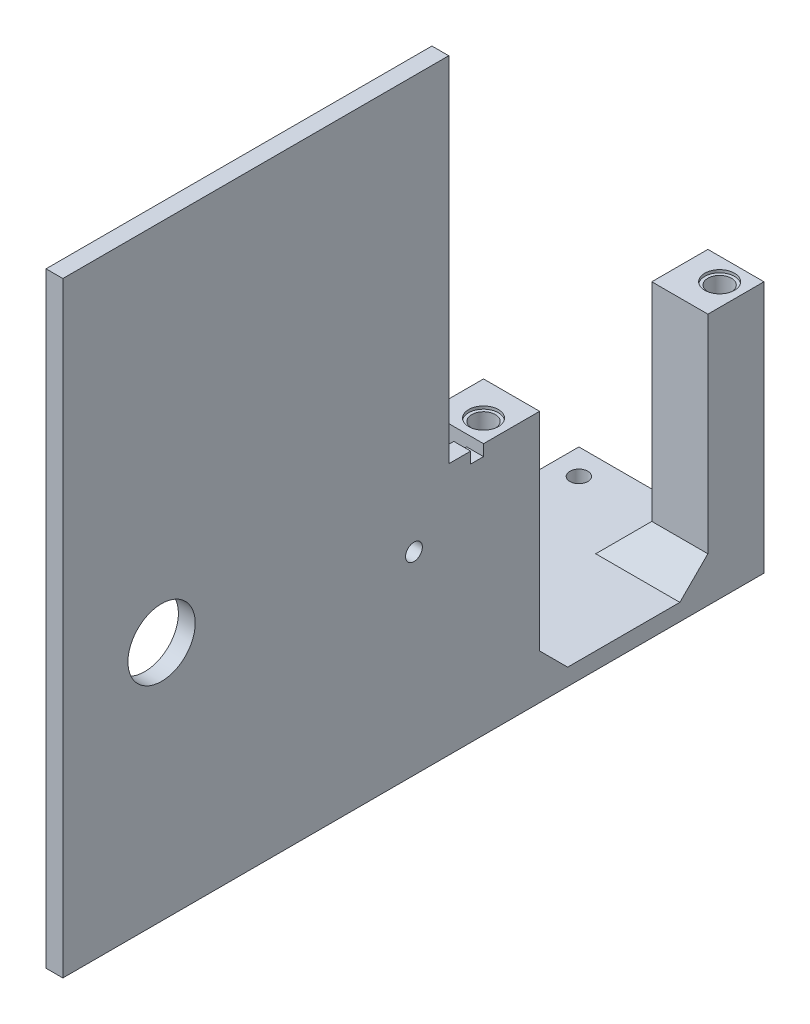
ISO-10303-21;
HEADER;
FILE_DESCRIPTION(('STEP AP214'),'2;1');
FILE_NAME('part.step','',(''),(''),'','','');
FILE_SCHEMA(('AUTOMOTIVE_DESIGN { 1 0 10303 214 1 1 1 1 }'));
ENDSEC;
DATA;
#1=APPLICATION_CONTEXT('core data for automotive mechanical design processes');
#2=APPLICATION_PROTOCOL_DEFINITION('international standard','automotive_design',2000,#1);
#3=PRODUCT_CONTEXT('',#1,'mechanical');
#4=PRODUCT('Part','Part','',(#3));
#5=PRODUCT_RELATED_PRODUCT_CATEGORY('part','',(#4));
#6=PRODUCT_DEFINITION_FORMATION('','',#4);
#7=PRODUCT_DEFINITION_CONTEXT('part definition',#1,'design');
#8=PRODUCT_DEFINITION('design','',#6,#7);
#9=PRODUCT_DEFINITION_SHAPE('','',#8);
#10=(LENGTH_UNIT() NAMED_UNIT(*) SI_UNIT(.MILLI.,.METRE.));
#11=(NAMED_UNIT(*) PLANE_ANGLE_UNIT() SI_UNIT($,.RADIAN.));
#12=(NAMED_UNIT(*) SI_UNIT($,.STERADIAN.) SOLID_ANGLE_UNIT());
#13=UNCERTAINTY_MEASURE_WITH_UNIT(LENGTH_MEASURE(1.E-05),#10,'distance_accuracy_value','');
#14=(GEOMETRIC_REPRESENTATION_CONTEXT(3) GLOBAL_UNCERTAINTY_ASSIGNED_CONTEXT((#13)) GLOBAL_UNIT_ASSIGNED_CONTEXT((#10,
#11,#12)) REPRESENTATION_CONTEXT('',''));
#15=CARTESIAN_POINT('',(0.,0.,0.));
#16=DIRECTION('',(0.,0.,1.));
#17=DIRECTION('',(1.,0.,0.));
#18=AXIS2_PLACEMENT_3D('',#15,#16,#17);
#19=CARTESIAN_POINT('',(26.4876033057851,43.,115.314049586777));
#20=DIRECTION('',(0.,-1.,0.));
#21=DIRECTION('',(0.,0.,-1.));
#22=AXIS2_PLACEMENT_3D('',#19,#20,#21);
#23=PLANE('',#22);
#24=DIRECTION('',(-1.,0.,0.));
#25=VECTOR('',#24,1.);
#26=CARTESIAN_POINT('',(23.4876033057851,43.,42.6140495867769));
#27=LINE('',#26,#25);
#28=CARTESIAN_POINT('',(26.4876033057851,43.,42.6140495867769));
#29=VERTEX_POINT('',#28);
#30=CARTESIAN_POINT('',(23.4876033057851,43.,42.6140495867769));
#31=VERTEX_POINT('',#30);
#32=EDGE_CURVE('E102',#29,#31,#27,.T.);
#33=ORIENTED_EDGE('',*,*,#32,.F.);
#34=DIRECTION('',(0.,0.,-1.));
#35=VECTOR('',#34,1.);
#36=CARTESIAN_POINT('',(26.4876033057851,43.,115.314049586777));
#37=LINE('',#36,#35);
#38=CARTESIAN_POINT('',(26.4876033057851,43.,40.3140495867769));
#39=VERTEX_POINT('',#38);
#40=EDGE_CURVE('E109',#29,#39,#37,.T.);
#41=ORIENTED_EDGE('',*,*,#40,.T.);
#42=DIRECTION('',(-1.,0.,0.));
#43=VECTOR('',#42,1.);
#44=CARTESIAN_POINT('',(26.4876033057851,43.,40.3140495867769));
#45=LINE('',#44,#43);
#46=CARTESIAN_POINT('',(23.4876033057851,43.,40.3140495867769));
#47=VERTEX_POINT('',#46);
#48=EDGE_CURVE('E284',#39,#47,#45,.T.);
#49=ORIENTED_EDGE('',*,*,#48,.T.);
#50=DIRECTION('',(0.,0.,-1.));
#51=VECTOR('',#50,1.);
#52=CARTESIAN_POINT('',(23.4876033057851,43.,115.314049586777));
#53=LINE('',#52,#51);
#54=EDGE_CURVE('E319',#31,#47,#53,.T.);
#55=ORIENTED_EDGE('',*,*,#54,.F.);
#56=EDGE_LOOP('',(#33,#41,#49,#55));
#57=FACE_BOUND('',#56,.T.);
#58=ADVANCED_FACE('F83',(#57),#23,.F.);
#59=CARTESIAN_POINT('',(-6.51239669421487,3.,40.3140495867769));
#60=DIRECTION('',(0.,0.,-1.));
#61=DIRECTION('',(-1.,0.,0.));
#62=AXIS2_PLACEMENT_3D('',#59,#60,#61);
#63=PLANE('',#62);
#64=DIRECTION('',(0.,-1.,0.));
#65=VECTOR('',#64,1.);
#66=CARTESIAN_POINT('',(23.4876033057851,43.,40.3140495867769));
#67=LINE('',#66,#65);
#68=CARTESIAN_POINT('',(23.4876033057851,0.,40.3140495867769));
#69=VERTEX_POINT('',#68);
#70=EDGE_CURVE('E303',#47,#69,#67,.T.);
#71=ORIENTED_EDGE('',*,*,#70,.F.);
#72=ORIENTED_EDGE('',*,*,#48,.F.);
#73=DIRECTION('',(0.,-1.,0.));
#74=VECTOR('',#73,1.);
#75=CARTESIAN_POINT('',(26.4876033057851,3.,40.3140495867769));
#76=LINE('',#75,#74);
#77=CARTESIAN_POINT('',(26.4876033057851,45.,40.3140495867769));
#78=VERTEX_POINT('',#77);
#79=EDGE_CURVE('E465',#78,#39,#76,.T.);
#80=ORIENTED_EDGE('',*,*,#79,.F.);
#81=DIRECTION('',(1.,0.,0.));
#82=VECTOR('',#81,1.);
#83=CARTESIAN_POINT('',(26.4876033057851,45.,40.3140495867769));
#84=LINE('',#83,#82);
#85=CARTESIAN_POINT('',(16.4876033057851,45.,40.3140495867769));
#86=VERTEX_POINT('',#85);
#87=EDGE_CURVE('E394',#86,#78,#84,.T.);
#88=ORIENTED_EDGE('',*,*,#87,.F.);
#89=DIRECTION('',(0.,-1.,0.));
#90=VECTOR('',#89,1.);
#91=CARTESIAN_POINT('',(16.4876033057851,45.,40.3140495867769));
#92=LINE('',#91,#90);
#93=CARTESIAN_POINT('',(16.4876033057851,8.00000000000004,40.3140495867769));
#94=VERTEX_POINT('',#93);
#95=EDGE_CURVE('E398',#86,#94,#92,.T.);
#96=ORIENTED_EDGE('',*,*,#95,.T.);
#97=DIRECTION('',(0.707106781186544,0.707106781186551,0.));
#98=VECTOR('',#97,1.);
#99=CARTESIAN_POINT('',(2.48760330578524,-6.00000000000001,40.3140495867769));
#100=LINE('',#99,#98);
#101=CARTESIAN_POINT('',(11.4876033057852,3.,40.3140495867769));
#102=VERTEX_POINT('',#101);
#103=EDGE_CURVE('E94',#94,#102,#100,.F.);
#104=ORIENTED_EDGE('',*,*,#103,.T.);
#105=DIRECTION('',(1.,0.,0.));
#106=VECTOR('',#105,1.);
#107=CARTESIAN_POINT('',(1.48760330578513,3.,40.3140495867769));
#108=LINE('',#107,#106);
#109=CARTESIAN_POINT('',(-6.51239669421487,3.,40.3140495867769));
#110=VERTEX_POINT('',#109);
#111=EDGE_CURVE('E436',#110,#102,#108,.T.);
#112=ORIENTED_EDGE('',*,*,#111,.F.);
#113=DIRECTION('',(0.,-1.,0.));
#114=VECTOR('',#113,1.);
#115=CARTESIAN_POINT('',(-6.51239669421487,3.,40.3140495867769));
#116=LINE('',#115,#114);
#117=CARTESIAN_POINT('',(-6.51239669421487,0.,40.3140495867769));
#118=VERTEX_POINT('',#117);
#119=EDGE_CURVE('E461',#110,#118,#116,.T.);
#120=ORIENTED_EDGE('',*,*,#119,.T.);
#121=DIRECTION('',(1.,0.,0.));
#122=VECTOR('',#121,1.);
#123=CARTESIAN_POINT('',(-6.51239669421487,0.,40.3140495867769));
#124=LINE('',#123,#122);
#125=EDGE_CURVE('E451',#118,#69,#124,.T.);
#126=ORIENTED_EDGE('',*,*,#125,.T.);
#127=EDGE_LOOP('',(#71,#72,#80,#88,#96,#104,#112,#120,#126));
#128=FACE_BOUND('',#127,.T.);
#129=ADVANCED_FACE('F529',(#128),#63,.F.);
#130=CARTESIAN_POINT('',(22.5376033057851,-7.,-5.73595041322314));
#131=DIRECTION('',(0.,1.,0.));
#132=DIRECTION('',(0.,0.,1.));
#133=AXIS2_PLACEMENT_3D('',#130,#131,#132);
#134=CYLINDRICAL_SURFACE('',#133,2.1);
#135=CARTESIAN_POINT('',(22.5376033057851,44.5,-5.73595041322314));
#136=DIRECTION('',(0.,1.,0.));
#137=DIRECTION('',(0.,0.,1.));
#138=AXIS2_PLACEMENT_3D('',#135,#136,#137);
#139=CIRCLE('',#138,2.1);
#140=CARTESIAN_POINT('',(22.5376033057851,44.5,-3.63595041322314));
#141=VERTEX_POINT('',#140);
#142=EDGE_CURVE('E510',#141,#141,#139,.F.);
#143=ORIENTED_EDGE('',*,*,#142,.F.);
#144=EDGE_LOOP('',(#143));
#145=FACE_BOUND('',#144,.T.);
#146=CARTESIAN_POINT('',(22.5376033057851,0.5,-5.73595041322314));
#147=DIRECTION('',(0.,-1.,0.));
#148=DIRECTION('',(0.,0.,-1.));
#149=AXIS2_PLACEMENT_3D('',#146,#147,#148);
#150=CIRCLE('',#149,2.1);
#151=CARTESIAN_POINT('',(22.5376033057851,0.5,-7.83595041322314));
#152=VERTEX_POINT('',#151);
#153=EDGE_CURVE('E88',#152,#152,#150,.F.);
#154=ORIENTED_EDGE('',*,*,#153,.F.);
#155=EDGE_LOOP('',(#154));
#156=FACE_BOUND('',#155,.T.);
#157=ADVANCED_FACE('F526',(#145,#156),#134,.F.);
#158=CARTESIAN_POINT('',(22.5376033057851,-7.,36.3640495867769));
#159=DIRECTION('',(0.,1.,0.));
#160=DIRECTION('',(0.,0.,1.));
#161=AXIS2_PLACEMENT_3D('',#158,#159,#160);
#162=CYLINDRICAL_SURFACE('',#161,2.1);
#163=CARTESIAN_POINT('',(22.5376033057851,44.5,36.3640495867769));
#164=DIRECTION('',(0.,1.,0.));
#165=DIRECTION('',(0.,0.,1.));
#166=AXIS2_PLACEMENT_3D('',#163,#164,#165);
#167=CIRCLE('',#166,2.1);
#168=CARTESIAN_POINT('',(22.5376033057851,44.5,38.4640495867769));
#169=VERTEX_POINT('',#168);
#170=EDGE_CURVE('E345',#169,#169,#167,.F.);
#171=ORIENTED_EDGE('',*,*,#170,.F.);
#172=EDGE_LOOP('',(#171));
#173=FACE_BOUND('',#172,.T.);
#174=CARTESIAN_POINT('',(22.5376033057851,0.5,36.3640495867769));
#175=DIRECTION('',(0.,-1.,0.));
#176=DIRECTION('',(0.,0.,-1.));
#177=AXIS2_PLACEMENT_3D('',#174,#175,#176);
#178=CIRCLE('',#177,2.1);
#179=CARTESIAN_POINT('',(22.5376033057851,0.5,34.2640495867769));
#180=VERTEX_POINT('',#179);
#181=EDGE_CURVE('E329',#180,#180,#178,.F.);
#182=ORIENTED_EDGE('',*,*,#181,.F.);
#183=EDGE_LOOP('',(#182));
#184=FACE_BOUND('',#183,.T.);
#185=ADVANCED_FACE('F528',(#173,#184),#162,.F.);
#186=CARTESIAN_POINT('',(0.,3.,0.));
#187=DIRECTION('',(0.,-1.,0.));
#188=DIRECTION('',(0.,0.,-1.));
#189=AXIS2_PLACEMENT_3D('',#186,#187,#188);
#190=PLANE('',#189);
#191=CARTESIAN_POINT('',(-1.96239669421488,3.,-5.13595041322314));
#192=DIRECTION('',(0.,1.,0.));
#193=DIRECTION('',(0.,0.,1.));
#194=AXIS2_PLACEMENT_3D('',#191,#192,#193);
#195=CIRCLE('',#194,1.6);
#196=CARTESIAN_POINT('',(-1.96239669421488,3.,-3.53595041322314));
#197=VERTEX_POINT('',#196);
#198=EDGE_CURVE('E419',#197,#197,#195,.T.);
#199=ORIENTED_EDGE('',*,*,#198,.F.);
#200=EDGE_LOOP('',(#199));
#201=FACE_BOUND('',#200,.T.);
#202=CARTESIAN_POINT('',(-1.96239669421487,3.,35.7640495867769));
#203=DIRECTION('',(0.,1.,0.));
#204=DIRECTION('',(0.,0.,1.));
#205=AXIS2_PLACEMENT_3D('',#202,#203,#204);
#206=CIRCLE('',#205,1.6);
#207=CARTESIAN_POINT('',(-1.96239669421487,3.,37.3640495867769));
#208=VERTEX_POINT('',#207);
#209=EDGE_CURVE('E411',#208,#208,#206,.T.);
#210=ORIENTED_EDGE('',*,*,#209,.F.);
#211=EDGE_LOOP('',(#210));
#212=FACE_BOUND('',#211,.T.);
#213=DIRECTION('',(-1.,0.,0.));
#214=VECTOR('',#213,1.);
#215=CARTESIAN_POINT('',(16.4876033057851,3.,5.31404958677684));
#216=LINE('',#215,#214);
#217=CARTESIAN_POINT('',(26.4876033057851,3.,5.31404958677684));
#218=VERTEX_POINT('',#217);
#219=CARTESIAN_POINT('',(11.4876033057851,3.,5.31404958677685));
#220=VERTEX_POINT('',#219);
#221=EDGE_CURVE('E480',#218,#220,#216,.T.);
#222=ORIENTED_EDGE('',*,*,#221,.T.);
#223=DIRECTION('',(0.,0.,-1.));
#224=VECTOR('',#223,1.);
#225=CARTESIAN_POINT('',(11.4876033057851,3.,-9.68595041322314));
#226=LINE('',#225,#224);
#227=CARTESIAN_POINT('',(11.4876033057851,3.,-9.68595041322314));
#228=VERTEX_POINT('',#227);
#229=EDGE_CURVE('E483',#220,#228,#226,.T.);
#230=ORIENTED_EDGE('',*,*,#229,.T.);
#231=DIRECTION('',(1.,0.,0.));
#232=VECTOR('',#231,1.);
#233=CARTESIAN_POINT('',(-6.51239669421488,3.,-9.68595041322314));
#234=LINE('',#233,#232);
#235=CARTESIAN_POINT('',(-6.51239669421488,3.,-9.68595041322314));
#236=VERTEX_POINT('',#235);
#237=EDGE_CURVE('E427',#236,#228,#234,.T.);
#238=ORIENTED_EDGE('',*,*,#237,.F.);
#239=DIRECTION('',(0.,0.,1.));
#240=VECTOR('',#239,1.);
#241=CARTESIAN_POINT('',(-6.51239669421488,3.,-9.68595041322314));
#242=LINE('',#241,#240);
#243=EDGE_CURVE('E440',#236,#110,#242,.T.);
#244=ORIENTED_EDGE('',*,*,#243,.T.);
#245=ORIENTED_EDGE('',*,*,#111,.T.);
#246=DIRECTION('',(0.,0.,-1.));
#247=VECTOR('',#246,1.);
#248=CARTESIAN_POINT('',(11.4876033057852,3.,30.3140495867769));
#249=LINE('',#248,#247);
#250=CARTESIAN_POINT('',(11.4876033057852,3.,25.3140495867769));
#251=VERTEX_POINT('',#250);
#252=EDGE_CURVE('E477',#102,#251,#249,.T.);
#253=ORIENTED_EDGE('',*,*,#252,.T.);
#254=DIRECTION('',(1.,0.,0.));
#255=VECTOR('',#254,1.);
#256=CARTESIAN_POINT('',(26.4876033057851,3.,25.3140495867769));
#257=LINE('',#256,#255);
#258=CARTESIAN_POINT('',(26.4876033057851,3.,25.3140495867769));
#259=VERTEX_POINT('',#258);
#260=EDGE_CURVE('E474',#251,#259,#257,.T.);
#261=ORIENTED_EDGE('',*,*,#260,.T.);
#262=DIRECTION('',(0.,0.,1.));
#263=VECTOR('',#262,1.);
#264=CARTESIAN_POINT('',(26.4876033057851,3.,-9.68595041322314));
#265=LINE('',#264,#263);
#266=EDGE_CURVE('E431',#218,#259,#265,.T.);
#267=ORIENTED_EDGE('',*,*,#266,.F.);
#268=EDGE_LOOP('',(#222,#230,#238,#244,#245,#253,#261,#267));
#269=FACE_BOUND('',#268,.T.);
#270=ADVANCED_FACE('F535',(#201,#212,#269),#190,.F.);
#271=CARTESIAN_POINT('',(0.,0.,0.));
#272=DIRECTION('',(0.,-1.,0.));
#273=DIRECTION('',(0.,0.,-1.));
#274=AXIS2_PLACEMENT_3D('',#271,#272,#273);
#275=PLANE('',#274);
#276=CARTESIAN_POINT('',(22.5376033057851,0.,36.3640495867769));
#277=DIRECTION('',(0.,1.,0.));
#278=DIRECTION('',(0.,0.,1.));
#279=AXIS2_PLACEMENT_3D('',#276,#277,#278);
#280=CIRCLE('',#279,2.65);
#281=CARTESIAN_POINT('',(22.5376033057851,0.,39.0140495867769));
#282=VERTEX_POINT('',#281);
#283=EDGE_CURVE('E330',#282,#282,#280,.T.);
#284=ORIENTED_EDGE('',*,*,#283,.T.);
#285=EDGE_LOOP('',(#284));
#286=FACE_BOUND('',#285,.T.);
#287=CARTESIAN_POINT('',(22.5376033057851,0.,-5.73595041322314));
#288=DIRECTION('',(0.,1.,0.));
#289=DIRECTION('',(0.,0.,1.));
#290=AXIS2_PLACEMENT_3D('',#287,#288,#289);
#291=CIRCLE('',#290,2.65);
#292=CARTESIAN_POINT('',(22.5376033057851,0.,-3.08595041322314));
#293=VERTEX_POINT('',#292);
#294=EDGE_CURVE('E324',#293,#293,#291,.T.);
#295=ORIENTED_EDGE('',*,*,#294,.T.);
#296=EDGE_LOOP('',(#295));
#297=FACE_BOUND('',#296,.T.);
#298=CARTESIAN_POINT('',(-1.96239669421488,0.,-5.13595041322314));
#299=DIRECTION('',(0.,1.,0.));
#300=DIRECTION('',(0.,0.,1.));
#301=AXIS2_PLACEMENT_3D('',#298,#299,#300);
#302=CIRCLE('',#301,1.6);
#303=CARTESIAN_POINT('',(-1.96239669421488,0.,-3.53595041322314));
#304=VERTEX_POINT('',#303);
#305=EDGE_CURVE('E415',#304,#304,#302,.T.);
#306=ORIENTED_EDGE('',*,*,#305,.T.);
#307=EDGE_LOOP('',(#306));
#308=FACE_BOUND('',#307,.T.);
#309=DIRECTION('',(0.,0.,1.));
#310=VECTOR('',#309,1.);
#311=CARTESIAN_POINT('',(-6.51239669421488,0.,-9.68595041322314));
#312=LINE('',#311,#310);
#313=CARTESIAN_POINT('',(-6.51239669421488,0.,-9.68595041322314));
#314=VERTEX_POINT('',#313);
#315=EDGE_CURVE('E432',#314,#118,#312,.T.);
#316=ORIENTED_EDGE('',*,*,#315,.F.);
#317=DIRECTION('',(1.,0.,0.));
#318=VECTOR('',#317,1.);
#319=CARTESIAN_POINT('',(1.48760330578512,0.,-9.68595041322314));
#320=LINE('',#319,#318);
#321=CARTESIAN_POINT('',(26.4876033057851,0.,-9.68595041322314));
#322=VERTEX_POINT('',#321);
#323=EDGE_CURVE('E423',#314,#322,#320,.T.);
#324=ORIENTED_EDGE('',*,*,#323,.T.);
#325=DIRECTION('',(0.,0.,1.));
#326=VECTOR('',#325,1.);
#327=CARTESIAN_POINT('',(26.4876033057851,0.,-9.68595041322314));
#328=LINE('',#327,#326);
#329=CARTESIAN_POINT('',(26.4876033057851,0.,115.314049586777));
#330=VERTEX_POINT('',#329);
#331=EDGE_CURVE('E448',#322,#330,#328,.T.);
#332=ORIENTED_EDGE('',*,*,#331,.T.);
#333=DIRECTION('',(1.,0.,0.));
#334=VECTOR('',#333,1.);
#335=CARTESIAN_POINT('',(26.4876033057851,0.,115.314049586777));
#336=LINE('',#335,#334);
#337=CARTESIAN_POINT('',(23.4876033057851,0.,115.314049586777));
#338=VERTEX_POINT('',#337);
#339=EDGE_CURVE('E306',#338,#330,#336,.T.);
#340=ORIENTED_EDGE('',*,*,#339,.F.);
#341=DIRECTION('',(0.,0.,-1.));
#342=VECTOR('',#341,1.);
#343=CARTESIAN_POINT('',(23.4876033057851,0.,115.314049586777));
#344=LINE('',#343,#342);
#345=EDGE_CURVE('E310',#338,#69,#344,.T.);
#346=ORIENTED_EDGE('',*,*,#345,.T.);
#347=ORIENTED_EDGE('',*,*,#125,.F.);
#348=EDGE_LOOP('',(#316,#324,#332,#340,#346,#347));
#349=FACE_BOUND('',#348,.T.);
#350=CARTESIAN_POINT('',(-1.96239669421487,0.,35.7640495867769));
#351=DIRECTION('',(0.,1.,0.));
#352=DIRECTION('',(0.,0.,1.));
#353=AXIS2_PLACEMENT_3D('',#350,#351,#352);
#354=CIRCLE('',#353,1.6);
#355=CARTESIAN_POINT('',(-1.96239669421487,0.,37.3640495867769));
#356=VERTEX_POINT('',#355);
#357=EDGE_CURVE('E410',#356,#356,#354,.T.);
#358=ORIENTED_EDGE('',*,*,#357,.T.);
#359=EDGE_LOOP('',(#358));
#360=FACE_BOUND('',#359,.T.);
#361=ADVANCED_FACE('F656',(#286,#297,#308,#349,#360),#275,.T.);
#362=CARTESIAN_POINT('',(-6.51239669421488,3.,-9.68595041322314));
#363=DIRECTION('',(1.,0.,0.));
#364=DIRECTION('',(0.,0.,-1.));
#365=AXIS2_PLACEMENT_3D('',#362,#363,#364);
#366=PLANE('',#365);
#367=ORIENTED_EDGE('',*,*,#315,.T.);
#368=ORIENTED_EDGE('',*,*,#119,.F.);
#369=ORIENTED_EDGE('',*,*,#243,.F.);
#370=DIRECTION('',(0.,-1.,0.));
#371=VECTOR('',#370,1.);
#372=CARTESIAN_POINT('',(-6.51239669421488,3.,-9.68595041322314));
#373=LINE('',#372,#371);
#374=EDGE_CURVE('E456',#236,#314,#373,.T.);
#375=ORIENTED_EDGE('',*,*,#374,.T.);
#376=EDGE_LOOP('',(#367,#368,#369,#375));
#377=FACE_BOUND('',#376,.T.);
#378=ADVANCED_FACE('F659',(#377),#366,.F.);
#379=CARTESIAN_POINT('',(26.4876033057851,3.,-9.68595041322314));
#380=DIRECTION('',(1.,0.,0.));
#381=DIRECTION('',(0.,0.,-1.));
#382=AXIS2_PLACEMENT_3D('',#379,#380,#381);
#383=PLANE('',#382);
#384=CARTESIAN_POINT('',(26.4876033057851,43.,97.7140495867768));
#385=DIRECTION('',(1.,0.,0.));
#386=DIRECTION('',(0.,0.,-1.));
#387=AXIS2_PLACEMENT_3D('',#384,#385,#386);
#388=CIRCLE('',#387,6.);
#389=CARTESIAN_POINT('',(26.4876033057851,43.,91.7140495867768));
#390=VERTEX_POINT('',#389);
#391=EDGE_CURVE('E264',#390,#390,#388,.T.);
#392=ORIENTED_EDGE('',*,*,#391,.F.);
#393=EDGE_LOOP('',(#392));
#394=FACE_BOUND('',#393,.T.);
#395=CARTESIAN_POINT('',(26.4876033057851,34.4999999999999,52.7140495867768));
#396=DIRECTION('',(1.,0.,0.));
#397=DIRECTION('',(0.,0.,-1.));
#398=AXIS2_PLACEMENT_3D('',#395,#396,#397);
#399=CIRCLE('',#398,1.5);
#400=CARTESIAN_POINT('',(26.4876033057851,34.4999999999999,51.2140495867768));
#401=VERTEX_POINT('',#400);
#402=EDGE_CURVE('E272',#401,#401,#399,.T.);
#403=ORIENTED_EDGE('',*,*,#402,.F.);
#404=EDGE_LOOP('',(#403));
#405=FACE_BOUND('',#404,.T.);
#406=ORIENTED_EDGE('',*,*,#331,.F.);
#407=DIRECTION('',(0.,-1.,0.));
#408=VECTOR('',#407,1.);
#409=CARTESIAN_POINT('',(26.4876033057851,3.,-9.68595041322314));
#410=LINE('',#409,#408);
#411=CARTESIAN_POINT('',(26.4876033057851,45.,-9.68595041322314));
#412=VERTEX_POINT('',#411);
#413=EDGE_CURVE('E444',#412,#322,#410,.T.);
#414=ORIENTED_EDGE('',*,*,#413,.F.);
#415=DIRECTION('',(0.,0.,-1.));
#416=VECTOR('',#415,1.);
#417=CARTESIAN_POINT('',(26.4876033057851,45.,-9.68595041322314));
#418=LINE('',#417,#416);
#419=CARTESIAN_POINT('',(26.4876033057851,45.,0.314049586776862));
#420=VERTEX_POINT('',#419);
#421=EDGE_CURVE('E358',#420,#412,#418,.T.);
#422=ORIENTED_EDGE('',*,*,#421,.F.);
#423=DIRECTION('',(0.,-1.,0.));
#424=VECTOR('',#423,1.);
#425=CARTESIAN_POINT('',(26.4876033057851,45.,0.314049586776862));
#426=LINE('',#425,#424);
#427=CARTESIAN_POINT('',(26.4876033057851,8.00000000000006,0.314049586776862));
#428=VERTEX_POINT('',#427);
#429=EDGE_CURVE('E372',#420,#428,#426,.T.);
#430=ORIENTED_EDGE('',*,*,#429,.T.);
#431=DIRECTION('',(0.,0.707106781186552,-0.707106781186543));
#432=VECTOR('',#431,1.);
#433=CARTESIAN_POINT('',(26.4876033057851,8.00000000000004,0.314049586776862));
#434=LINE('',#433,#432);
#435=EDGE_CURVE('E499',#428,#218,#434,.F.);
#436=ORIENTED_EDGE('',*,*,#435,.T.);
#437=ORIENTED_EDGE('',*,*,#266,.T.);
#438=DIRECTION('',(0.,-0.707106781186551,-0.707106781186544));
#439=VECTOR('',#438,1.);
#440=CARTESIAN_POINT('',(26.4876033057851,8.00000000000003,30.3140495867769));
#441=LINE('',#440,#439);
#442=CARTESIAN_POINT('',(26.4876033057851,8.00000000000004,30.3140495867769));
#443=VERTEX_POINT('',#442);
#444=EDGE_CURVE('E12',#259,#443,#441,.F.);
#445=ORIENTED_EDGE('',*,*,#444,.T.);
#446=DIRECTION('',(0.,-1.,0.));
#447=VECTOR('',#446,1.);
#448=CARTESIAN_POINT('',(26.4876033057851,45.,30.3140495867769));
#449=LINE('',#448,#447);
#450=CARTESIAN_POINT('',(26.4876033057851,45.,30.3140495867769));
#451=VERTEX_POINT('',#450);
#452=EDGE_CURVE('E406',#451,#443,#449,.T.);
#453=ORIENTED_EDGE('',*,*,#452,.F.);
#454=DIRECTION('',(0.,0.,-1.));
#455=VECTOR('',#454,1.);
#456=CARTESIAN_POINT('',(26.4876033057851,45.,40.3140495867769));
#457=LINE('',#456,#455);
#458=EDGE_CURVE('E384',#78,#451,#457,.T.);
#459=ORIENTED_EDGE('',*,*,#458,.F.);
#460=ORIENTED_EDGE('',*,*,#79,.T.);
#461=ORIENTED_EDGE('',*,*,#40,.F.);
#462=DIRECTION('',(0.,-1.,0.));
#463=VECTOR('',#462,1.);
#464=CARTESIAN_POINT('',(26.4876033057851,49.920365840057,42.6140495867769));
#465=LINE('',#464,#463);
#466=CARTESIAN_POINT('',(26.4876033057851,45.,42.6140495867769));
#467=VERTEX_POINT('',#466);
#468=EDGE_CURVE('E281',#467,#29,#465,.T.);
#469=ORIENTED_EDGE('',*,*,#468,.F.);
#470=DIRECTION('',(0.,0.,-1.));
#471=VECTOR('',#470,1.);
#472=CARTESIAN_POINT('',(26.4876033057851,45.,42.6140495867769));
#473=LINE('',#472,#471);
#474=CARTESIAN_POINT('',(26.4876033057851,45.,46.5140495867769));
#475=VERTEX_POINT('',#474);
#476=EDGE_CURVE('E232',#475,#467,#473,.T.);
#477=ORIENTED_EDGE('',*,*,#476,.F.);
#478=DIRECTION('',(0.,-1.,0.));
#479=VECTOR('',#478,1.);
#480=CARTESIAN_POINT('',(26.4876033057851,48.,46.5140495867769));
#481=LINE('',#480,#479);
#482=CARTESIAN_POINT('',(26.4876033057851,108.,46.5140495867769));
#483=VERTEX_POINT('',#482);
#484=EDGE_CURVE('E224',#483,#475,#481,.T.);
#485=ORIENTED_EDGE('',*,*,#484,.F.);
#486=DIRECTION('',(0.,0.,-1.));
#487=VECTOR('',#486,1.);
#488=CARTESIAN_POINT('',(26.4876033057851,108.,46.5140495867769));
#489=LINE('',#488,#487);
#490=CARTESIAN_POINT('',(26.4876033057851,108.,115.314049586777));
#491=VERTEX_POINT('',#490);
#492=EDGE_CURVE('E230',#491,#483,#489,.T.);
#493=ORIENTED_EDGE('',*,*,#492,.F.);
#494=DIRECTION('',(0.,1.,0.));
#495=VECTOR('',#494,1.);
#496=CARTESIAN_POINT('',(26.4876033057851,43.,115.314049586777));
#497=LINE('',#496,#495);
#498=EDGE_CURVE('E299',#330,#491,#497,.T.);
#499=ORIENTED_EDGE('',*,*,#498,.F.);
#500=EDGE_LOOP('',(#406,#414,#422,#430,#436,#437,#445,#453,#459,#460,#461,#469,#477,#485,#493,#499));
#501=FACE_BOUND('',#500,.T.);
#502=ADVANCED_FACE('F227',(#394,#405,#501),#383,.T.);
#503=CARTESIAN_POINT('',(1.48760330578512,3.,-9.68595041322314));
#504=DIRECTION('',(0.,0.,-1.));
#505=DIRECTION('',(-1.,0.,0.));
#506=AXIS2_PLACEMENT_3D('',#503,#504,#505);
#507=PLANE('',#506);
#508=ORIENTED_EDGE('',*,*,#323,.F.);
#509=ORIENTED_EDGE('',*,*,#374,.F.);
#510=ORIENTED_EDGE('',*,*,#237,.T.);
#511=DIRECTION('',(-0.707106781186543,-0.707106781186552,0.));
#512=VECTOR('',#511,1.);
#513=CARTESIAN_POINT('',(16.4876033057851,8.00000000000004,-9.68595041322314));
#514=LINE('',#513,#512);
#515=CARTESIAN_POINT('',(16.4876033057851,8.00000000000006,-9.68595041322314));
#516=VERTEX_POINT('',#515);
#517=EDGE_CURVE('E496',#228,#516,#514,.F.);
#518=ORIENTED_EDGE('',*,*,#517,.T.);
#519=DIRECTION('',(0.,-1.,0.));
#520=VECTOR('',#519,1.);
#521=CARTESIAN_POINT('',(16.4876033057851,45.,-9.68595041322314));
#522=LINE('',#521,#520);
#523=CARTESIAN_POINT('',(16.4876033057851,45.,-9.68595041322314));
#524=VERTEX_POINT('',#523);
#525=EDGE_CURVE('E380',#524,#516,#522,.T.);
#526=ORIENTED_EDGE('',*,*,#525,.F.);
#527=DIRECTION('',(-1.,0.,0.));
#528=VECTOR('',#527,1.);
#529=CARTESIAN_POINT('',(26.4876033057851,45.,-9.68595041322314));
#530=LINE('',#529,#528);
#531=EDGE_CURVE('E362',#412,#524,#530,.T.);
#532=ORIENTED_EDGE('',*,*,#531,.F.);
#533=ORIENTED_EDGE('',*,*,#413,.T.);
#534=EDGE_LOOP('',(#508,#509,#510,#518,#526,#532,#533));
#535=FACE_BOUND('',#534,.T.);
#536=ADVANCED_FACE('F602',(#535),#507,.T.);
#537=CARTESIAN_POINT('',(-1.96239669421488,3.,-5.13595041322314));
#538=DIRECTION('',(0.,-1.,0.));
#539=DIRECTION('',(0.,0.,-1.));
#540=AXIS2_PLACEMENT_3D('',#537,#538,#539);
#541=CYLINDRICAL_SURFACE('',#540,1.6);
#542=ORIENTED_EDGE('',*,*,#198,.T.);
#543=EDGE_LOOP('',(#542));
#544=FACE_BOUND('',#543,.T.);
#545=ORIENTED_EDGE('',*,*,#305,.F.);
#546=EDGE_LOOP('',(#545));
#547=FACE_BOUND('',#546,.T.);
#548=ADVANCED_FACE('F646',(#544,#547),#541,.F.);
#549=CARTESIAN_POINT('',(-1.96239669421487,3.,35.7640495867769));
#550=DIRECTION('',(0.,-1.,0.));
#551=DIRECTION('',(0.,0.,-1.));
#552=AXIS2_PLACEMENT_3D('',#549,#550,#551);
#553=CYLINDRICAL_SURFACE('',#552,1.6);
#554=ORIENTED_EDGE('',*,*,#209,.T.);
#555=EDGE_LOOP('',(#554));
#556=FACE_BOUND('',#555,.T.);
#557=ORIENTED_EDGE('',*,*,#357,.F.);
#558=EDGE_LOOP('',(#557));
#559=FACE_BOUND('',#558,.T.);
#560=ADVANCED_FACE('F639',(#556,#559),#553,.F.);
#561=CARTESIAN_POINT('',(26.4876033057851,45.,30.3140495867769));
#562=DIRECTION('',(0.,0.,1.));
#563=DIRECTION('',(1.,0.,0.));
#564=AXIS2_PLACEMENT_3D('',#561,#562,#563);
#565=PLANE('',#564);
#566=ORIENTED_EDGE('',*,*,#452,.T.);
#567=DIRECTION('',(-1.,0.,0.));
#568=VECTOR('',#567,1.);
#569=CARTESIAN_POINT('',(16.4876033057851,8.00000000000003,30.3140495867769));
#570=LINE('',#569,#568);
#571=CARTESIAN_POINT('',(16.4876033057851,8.00000000000004,30.3140495867769));
#572=VERTEX_POINT('',#571);
#573=EDGE_CURVE('E493',#443,#572,#570,.T.);
#574=ORIENTED_EDGE('',*,*,#573,.T.);
#575=DIRECTION('',(0.,-1.,0.));
#576=VECTOR('',#575,1.);
#577=CARTESIAN_POINT('',(16.4876033057851,45.,30.3140495867769));
#578=LINE('',#577,#576);
#579=CARTESIAN_POINT('',(16.4876033057851,45.,30.3140495867769));
#580=VERTEX_POINT('',#579);
#581=EDGE_CURVE('E402',#580,#572,#578,.T.);
#582=ORIENTED_EDGE('',*,*,#581,.F.);
#583=DIRECTION('',(-1.,0.,0.));
#584=VECTOR('',#583,1.);
#585=CARTESIAN_POINT('',(26.4876033057851,45.,30.3140495867769));
#586=LINE('',#585,#584);
#587=EDGE_CURVE('E388',#451,#580,#586,.T.);
#588=ORIENTED_EDGE('',*,*,#587,.F.);
#589=EDGE_LOOP('',(#566,#574,#582,#588));
#590=FACE_BOUND('',#589,.T.);
#591=ADVANCED_FACE('F637',(#590),#565,.F.);
#592=CARTESIAN_POINT('',(16.4876033057851,45.,40.3140495867769));
#593=DIRECTION('',(1.,0.,0.));
#594=DIRECTION('',(0.,0.,-1.));
#595=AXIS2_PLACEMENT_3D('',#592,#593,#594);
#596=PLANE('',#595);
#597=ORIENTED_EDGE('',*,*,#581,.T.);
#598=DIRECTION('',(0.,0.,1.));
#599=VECTOR('',#598,1.);
#600=CARTESIAN_POINT('',(16.4876033057851,8.00000000000003,40.3140495867769));
#601=LINE('',#600,#599);
#602=EDGE_CURVE('E489',#572,#94,#601,.T.);
#603=ORIENTED_EDGE('',*,*,#602,.T.);
#604=ORIENTED_EDGE('',*,*,#95,.F.);
#605=DIRECTION('',(0.,0.,1.));
#606=VECTOR('',#605,1.);
#607=CARTESIAN_POINT('',(16.4876033057851,45.,40.3140495867769));
#608=LINE('',#607,#606);
#609=EDGE_CURVE('E391',#580,#86,#608,.T.);
#610=ORIENTED_EDGE('',*,*,#609,.F.);
#611=EDGE_LOOP('',(#597,#603,#604,#610));
#612=FACE_BOUND('',#611,.T.);
#613=ADVANCED_FACE('F627',(#612),#596,.F.);
#614=CARTESIAN_POINT('',(0.,45.,0.));
#615=DIRECTION('',(0.,1.,0.));
#616=DIRECTION('',(0.,0.,1.));
#617=AXIS2_PLACEMENT_3D('',#614,#615,#616);
#618=PLANE('',#617);
#619=CARTESIAN_POINT('',(22.5376033057851,45.,36.3640495867769));
#620=DIRECTION('',(0.,1.,0.));
#621=DIRECTION('',(0.,0.,1.));
#622=AXIS2_PLACEMENT_3D('',#619,#620,#621);
#623=CIRCLE('',#622,2.65);
#624=CARTESIAN_POINT('',(22.5376033057851,45.,39.0140495867769));
#625=VERTEX_POINT('',#624);
#626=EDGE_CURVE('E346',#625,#625,#623,.T.);
#627=ORIENTED_EDGE('',*,*,#626,.F.);
#628=EDGE_LOOP('',(#627));
#629=FACE_BOUND('',#628,.T.);
#630=ORIENTED_EDGE('',*,*,#458,.T.);
#631=ORIENTED_EDGE('',*,*,#587,.T.);
#632=ORIENTED_EDGE('',*,*,#609,.T.);
#633=ORIENTED_EDGE('',*,*,#87,.T.);
#634=EDGE_LOOP('',(#630,#631,#632,#633));
#635=FACE_BOUND('',#634,.T.);
#636=ADVANCED_FACE('F634',(#629,#635),#618,.T.);
#637=CARTESIAN_POINT('',(16.4876033057851,45.,-9.68595041322314));
#638=DIRECTION('',(1.,0.,0.));
#639=DIRECTION('',(0.,0.,-1.));
#640=AXIS2_PLACEMENT_3D('',#637,#638,#639);
#641=PLANE('',#640);
#642=ORIENTED_EDGE('',*,*,#525,.T.);
#643=DIRECTION('',(0.,0.,1.));
#644=VECTOR('',#643,1.);
#645=CARTESIAN_POINT('',(16.4876033057851,8.00000000000004,0.314049586776863));
#646=LINE('',#645,#644);
#647=CARTESIAN_POINT('',(16.4876033057851,8.00000000000006,0.314049586776863));
#648=VERTEX_POINT('',#647);
#649=EDGE_CURVE('E460',#516,#648,#646,.T.);
#650=ORIENTED_EDGE('',*,*,#649,.T.);
#651=DIRECTION('',(0.,-1.,0.));
#652=VECTOR('',#651,1.);
#653=CARTESIAN_POINT('',(16.4876033057851,45.,0.314049586776863));
#654=LINE('',#653,#652);
#655=CARTESIAN_POINT('',(16.4876033057851,45.,0.314049586776863));
#656=VERTEX_POINT('',#655);
#657=EDGE_CURVE('E376',#656,#648,#654,.T.);
#658=ORIENTED_EDGE('',*,*,#657,.F.);
#659=DIRECTION('',(0.,0.,1.));
#660=VECTOR('',#659,1.);
#661=CARTESIAN_POINT('',(16.4876033057851,45.,-9.68595041322314));
#662=LINE('',#661,#660);
#663=EDGE_CURVE('E366',#524,#656,#662,.T.);
#664=ORIENTED_EDGE('',*,*,#663,.F.);
#665=EDGE_LOOP('',(#642,#650,#658,#664));
#666=FACE_BOUND('',#665,.T.);
#667=ADVANCED_FACE('F608',(#666),#641,.F.);
#668=CARTESIAN_POINT('',(26.4876033057851,45.,0.314049586776862));
#669=DIRECTION('',(0.,0.,-1.));
#670=DIRECTION('',(-1.,0.,0.));
#671=AXIS2_PLACEMENT_3D('',#668,#669,#670);
#672=PLANE('',#671);
#673=ORIENTED_EDGE('',*,*,#657,.T.);
#674=DIRECTION('',(1.,0.,0.));
#675=VECTOR('',#674,1.);
#676=CARTESIAN_POINT('',(26.4876033057851,8.00000000000004,0.314049586776862));
#677=LINE('',#676,#675);
#678=EDGE_CURVE('E486',#648,#428,#677,.T.);
#679=ORIENTED_EDGE('',*,*,#678,.T.);
#680=ORIENTED_EDGE('',*,*,#429,.F.);
#681=DIRECTION('',(1.,0.,0.));
#682=VECTOR('',#681,1.);
#683=CARTESIAN_POINT('',(26.4876033057851,45.,0.314049586776862));
#684=LINE('',#683,#682);
#685=EDGE_CURVE('E369',#656,#420,#684,.T.);
#686=ORIENTED_EDGE('',*,*,#685,.F.);
#687=EDGE_LOOP('',(#673,#679,#680,#686));
#688=FACE_BOUND('',#687,.T.);
#689=ADVANCED_FACE('F594',(#688),#672,.F.);
#690=CARTESIAN_POINT('',(0.,45.,0.));
#691=DIRECTION('',(0.,-1.,0.));
#692=DIRECTION('',(0.,0.,-1.));
#693=AXIS2_PLACEMENT_3D('',#690,#691,#692);
#694=PLANE('',#693);
#695=CARTESIAN_POINT('',(22.5376033057851,45.,-5.73595041322314));
#696=DIRECTION('',(0.,1.,0.));
#697=DIRECTION('',(0.,0.,1.));
#698=AXIS2_PLACEMENT_3D('',#695,#696,#697);
#699=CIRCLE('',#698,2.65);
#700=CARTESIAN_POINT('',(22.5376033057851,45.,-3.08595041322314));
#701=VERTEX_POINT('',#700);
#702=EDGE_CURVE('E354',#701,#701,#699,.T.);
#703=ORIENTED_EDGE('',*,*,#702,.F.);
#704=EDGE_LOOP('',(#703));
#705=FACE_BOUND('',#704,.T.);
#706=ORIENTED_EDGE('',*,*,#421,.T.);
#707=ORIENTED_EDGE('',*,*,#531,.T.);
#708=ORIENTED_EDGE('',*,*,#663,.T.);
#709=ORIENTED_EDGE('',*,*,#685,.T.);
#710=EDGE_LOOP('',(#706,#707,#708,#709));
#711=FACE_BOUND('',#710,.T.);
#712=ADVANCED_FACE('F590',(#705,#711),#694,.F.);
#713=CARTESIAN_POINT('',(26.4876033057851,8.00000000000004,0.314049586776862));
#714=DIRECTION('',(0.,0.707106781186543,0.707106781186552));
#715=DIRECTION('',(-1.,0.,0.));
#716=AXIS2_PLACEMENT_3D('',#713,#714,#715);
#717=PLANE('',#716);
#718=ORIENTED_EDGE('',*,*,#435,.F.);
#719=ORIENTED_EDGE('',*,*,#678,.F.);
#720=DIRECTION('',(-0.577350269189624,-0.57735026918963,0.577350269189623));
#721=VECTOR('',#720,1.);
#722=CARTESIAN_POINT('',(19.8209366391184,11.3333333333334,-3.01928374655645));
#723=LINE('',#722,#721);
#724=EDGE_CURVE('E363',#220,#648,#723,.F.);
#725=ORIENTED_EDGE('',*,*,#724,.F.);
#726=ORIENTED_EDGE('',*,*,#221,.F.);
#727=EDGE_LOOP('',(#718,#719,#725,#726));
#728=FACE_BOUND('',#727,.T.);
#729=ADVANCED_FACE('F593',(#728),#717,.T.);
#730=CARTESIAN_POINT('',(16.4876033057851,8.00000000000004,-9.68595041322314));
#731=DIRECTION('',(-0.707106781186552,0.707106781186543,0.));
#732=DIRECTION('',(0.,0.,-1.));
#733=AXIS2_PLACEMENT_3D('',#730,#731,#732);
#734=PLANE('',#733);
#735=ORIENTED_EDGE('',*,*,#517,.F.);
#736=ORIENTED_EDGE('',*,*,#229,.F.);
#737=ORIENTED_EDGE('',*,*,#724,.T.);
#738=ORIENTED_EDGE('',*,*,#649,.F.);
#739=EDGE_LOOP('',(#735,#736,#737,#738));
#740=FACE_BOUND('',#739,.T.);
#741=ADVANCED_FACE('F670',(#740),#734,.T.);
#742=CARTESIAN_POINT('',(26.4876033057851,8.00000000000003,30.3140495867769));
#743=DIRECTION('',(0.,0.707106781186544,-0.707106781186551));
#744=DIRECTION('',(1.,0.,0.));
#745=AXIS2_PLACEMENT_3D('',#742,#743,#744);
#746=PLANE('',#745);
#747=ORIENTED_EDGE('',*,*,#444,.F.);
#748=ORIENTED_EDGE('',*,*,#260,.F.);
#749=DIRECTION('',(0.577350269189624,0.57735026918963,0.577350269189624));
#750=VECTOR('',#749,1.);
#751=CARTESIAN_POINT('',(19.8209366391184,11.3333333333334,33.6473829201102));
#752=LINE('',#751,#750);
#753=EDGE_CURVE('E506',#572,#251,#752,.F.);
#754=ORIENTED_EDGE('',*,*,#753,.F.);
#755=ORIENTED_EDGE('',*,*,#573,.F.);
#756=EDGE_LOOP('',(#747,#748,#754,#755));
#757=FACE_BOUND('',#756,.T.);
#758=ADVANCED_FACE('F86',(#757),#746,.T.);
#759=CARTESIAN_POINT('',(16.4876033057851,8.00000000000003,40.3140495867769));
#760=DIRECTION('',(-0.707106781186551,0.707106781186544,0.));
#761=DIRECTION('',(0.,0.,-1.));
#762=AXIS2_PLACEMENT_3D('',#759,#760,#761);
#763=PLANE('',#762);
#764=ORIENTED_EDGE('',*,*,#753,.T.);
#765=ORIENTED_EDGE('',*,*,#252,.F.);
#766=ORIENTED_EDGE('',*,*,#103,.F.);
#767=ORIENTED_EDGE('',*,*,#602,.F.);
#768=EDGE_LOOP('',(#764,#765,#766,#767));
#769=FACE_BOUND('',#768,.T.);
#770=ADVANCED_FACE('F573',(#769),#763,.T.);
#771=CARTESIAN_POINT('',(22.5376033057851,44.5,36.3640495867769));
#772=DIRECTION('',(0.,1.,0.));
#773=DIRECTION('',(0.,0.,1.));
#774=AXIS2_PLACEMENT_3D('',#771,#772,#773);
#775=PLANE('',#774);
#776=CARTESIAN_POINT('',(22.5376033057851,44.5,36.3640495867769));
#777=DIRECTION('',(0.,1.,0.));
#778=DIRECTION('',(0.,0.,1.));
#779=AXIS2_PLACEMENT_3D('',#776,#777,#778);
#780=CIRCLE('',#779,2.65);
#781=CARTESIAN_POINT('',(22.5376033057851,44.5,39.0140495867769));
#782=VERTEX_POINT('',#781);
#783=EDGE_CURVE('E341',#782,#782,#780,.T.);
#784=ORIENTED_EDGE('',*,*,#783,.T.);
#785=EDGE_LOOP('',(#784));
#786=FACE_BOUND('',#785,.T.);
#787=ORIENTED_EDGE('',*,*,#170,.T.);
#788=EDGE_LOOP('',(#787));
#789=FACE_BOUND('',#788,.T.);
#790=ADVANCED_FACE('F569',(#786,#789),#775,.T.);
#791=CARTESIAN_POINT('',(22.5376033057851,44.5,36.3640495867769));
#792=DIRECTION('',(0.,1.,0.));
#793=DIRECTION('',(0.,0.,1.));
#794=AXIS2_PLACEMENT_3D('',#791,#792,#793);
#795=CYLINDRICAL_SURFACE('',#794,2.65);
#796=ORIENTED_EDGE('',*,*,#783,.F.);
#797=EDGE_LOOP('',(#796));
#798=FACE_BOUND('',#797,.T.);
#799=ORIENTED_EDGE('',*,*,#626,.T.);
#800=EDGE_LOOP('',(#799));
#801=FACE_BOUND('',#800,.T.);
#802=ADVANCED_FACE('F572',(#798,#801),#795,.F.);
#803=CARTESIAN_POINT('',(22.5376033057851,44.5,-5.73595041322314));
#804=DIRECTION('',(0.,1.,0.));
#805=DIRECTION('',(0.,0.,1.));
#806=AXIS2_PLACEMENT_3D('',#803,#804,#805);
#807=PLANE('',#806);
#808=CARTESIAN_POINT('',(22.5376033057851,44.5,-5.73595041322314));
#809=DIRECTION('',(0.,1.,0.));
#810=DIRECTION('',(0.,0.,1.));
#811=AXIS2_PLACEMENT_3D('',#808,#809,#810);
#812=CIRCLE('',#811,2.65);
#813=CARTESIAN_POINT('',(22.5376033057851,44.5,-3.08595041322314));
#814=VERTEX_POINT('',#813);
#815=EDGE_CURVE('E350',#814,#814,#812,.T.);
#816=ORIENTED_EDGE('',*,*,#815,.T.);
#817=EDGE_LOOP('',(#816));
#818=FACE_BOUND('',#817,.T.);
#819=ORIENTED_EDGE('',*,*,#142,.T.);
#820=EDGE_LOOP('',(#819));
#821=FACE_BOUND('',#820,.T.);
#822=ADVANCED_FACE('F577',(#818,#821),#807,.T.);
#823=CARTESIAN_POINT('',(22.5376033057851,44.5,-5.73595041322314));
#824=DIRECTION('',(0.,1.,0.));
#825=DIRECTION('',(0.,0.,1.));
#826=AXIS2_PLACEMENT_3D('',#823,#824,#825);
#827=CYLINDRICAL_SURFACE('',#826,2.65);
#828=ORIENTED_EDGE('',*,*,#815,.F.);
#829=EDGE_LOOP('',(#828));
#830=FACE_BOUND('',#829,.T.);
#831=ORIENTED_EDGE('',*,*,#702,.T.);
#832=EDGE_LOOP('',(#831));
#833=FACE_BOUND('',#832,.T.);
#834=ADVANCED_FACE('F564',(#830,#833),#827,.F.);
#835=CARTESIAN_POINT('',(22.5376033057851,0.5,-5.73595041322314));
#836=DIRECTION('',(0.,-1.,0.));
#837=DIRECTION('',(0.,0.,1.));
#838=AXIS2_PLACEMENT_3D('',#835,#836,#837);
#839=PLANE('',#838);
#840=CARTESIAN_POINT('',(22.5376033057851,0.5,-5.73595041322314));
#841=DIRECTION('',(0.,1.,0.));
#842=DIRECTION('',(0.,0.,1.));
#843=AXIS2_PLACEMENT_3D('',#840,#841,#842);
#844=CIRCLE('',#843,2.65);
#845=CARTESIAN_POINT('',(22.5376033057851,0.5,-3.08595041322314));
#846=VERTEX_POINT('',#845);
#847=EDGE_CURVE('E334',#846,#846,#844,.T.);
#848=ORIENTED_EDGE('',*,*,#847,.F.);
#849=EDGE_LOOP('',(#848));
#850=FACE_BOUND('',#849,.T.);
#851=ORIENTED_EDGE('',*,*,#153,.T.);
#852=EDGE_LOOP('',(#851));
#853=FACE_BOUND('',#852,.T.);
#854=ADVANCED_FACE('F524',(#850,#853),#839,.T.);
#855=CARTESIAN_POINT('',(22.5376033057851,0.5,-5.73595041322314));
#856=DIRECTION('',(0.,-1.,0.));
#857=DIRECTION('',(0.,0.,-1.));
#858=AXIS2_PLACEMENT_3D('',#855,#856,#857);
#859=CYLINDRICAL_SURFACE('',#858,2.65);
#860=ORIENTED_EDGE('',*,*,#847,.T.);
#861=EDGE_LOOP('',(#860));
#862=FACE_BOUND('',#861,.T.);
#863=ORIENTED_EDGE('',*,*,#294,.F.);
#864=EDGE_LOOP('',(#863));
#865=FACE_BOUND('',#864,.T.);
#866=ADVANCED_FACE('F557',(#862,#865),#859,.F.);
#867=CARTESIAN_POINT('',(22.5376033057851,0.5,36.3640495867769));
#868=DIRECTION('',(0.,-1.,0.));
#869=DIRECTION('',(0.,0.,1.));
#870=AXIS2_PLACEMENT_3D('',#867,#868,#869);
#871=PLANE('',#870);
#872=CARTESIAN_POINT('',(22.5376033057851,0.5,36.3640495867769));
#873=DIRECTION('',(0.,1.,0.));
#874=DIRECTION('',(0.,0.,1.));
#875=AXIS2_PLACEMENT_3D('',#872,#873,#874);
#876=CIRCLE('',#875,2.65);
#877=CARTESIAN_POINT('',(22.5376033057851,0.5,39.0140495867769));
#878=VERTEX_POINT('',#877);
#879=EDGE_CURVE('E325',#878,#878,#876,.T.);
#880=ORIENTED_EDGE('',*,*,#879,.F.);
#881=EDGE_LOOP('',(#880));
#882=FACE_BOUND('',#881,.T.);
#883=ORIENTED_EDGE('',*,*,#181,.T.);
#884=EDGE_LOOP('',(#883));
#885=FACE_BOUND('',#884,.T.);
#886=ADVANCED_FACE('F553',(#882,#885),#871,.T.);
#887=CARTESIAN_POINT('',(22.5376033057851,0.5,36.3640495867769));
#888=DIRECTION('',(0.,-1.,0.));
#889=DIRECTION('',(0.,0.,-1.));
#890=AXIS2_PLACEMENT_3D('',#887,#888,#889);
#891=CYLINDRICAL_SURFACE('',#890,2.65);
#892=ORIENTED_EDGE('',*,*,#879,.T.);
#893=EDGE_LOOP('',(#892));
#894=FACE_BOUND('',#893,.T.);
#895=ORIENTED_EDGE('',*,*,#283,.F.);
#896=EDGE_LOOP('',(#895));
#897=FACE_BOUND('',#896,.T.);
#898=ADVANCED_FACE('F556',(#894,#897),#891,.F.);
#899=CARTESIAN_POINT('',(23.4876033057851,43.,115.314049586777));
#900=DIRECTION('',(1.,0.,0.));
#901=DIRECTION('',(0.,1.,0.));
#902=AXIS2_PLACEMENT_3D('',#899,#900,#901);
#903=PLANE('',#902);
#904=CARTESIAN_POINT('',(23.4876033057851,43.,97.7140495867768));
#905=DIRECTION('',(-1.,0.,0.));
#906=DIRECTION('',(0.,-1.,0.));
#907=AXIS2_PLACEMENT_3D('',#904,#905,#906);
#908=CIRCLE('',#907,6.);
#909=CARTESIAN_POINT('',(23.4876033057851,37.,97.7140495867768));
#910=VERTEX_POINT('',#909);
#911=EDGE_CURVE('E260',#910,#910,#908,.T.);
#912=ORIENTED_EDGE('',*,*,#911,.F.);
#913=EDGE_LOOP('',(#912));
#914=FACE_BOUND('',#913,.T.);
#915=CARTESIAN_POINT('',(23.4876033057851,34.4999999999999,52.7140495867768));
#916=DIRECTION('',(-1.,0.,0.));
#917=DIRECTION('',(0.,-1.,0.));
#918=AXIS2_PLACEMENT_3D('',#915,#916,#917);
#919=CIRCLE('',#918,1.5);
#920=CARTESIAN_POINT('',(23.4876033057851,32.9999999999999,52.7140495867768));
#921=VERTEX_POINT('',#920);
#922=EDGE_CURVE('E268',#921,#921,#919,.T.);
#923=ORIENTED_EDGE('',*,*,#922,.F.);
#924=EDGE_LOOP('',(#923));
#925=FACE_BOUND('',#924,.T.);
#926=ORIENTED_EDGE('',*,*,#70,.T.);
#927=ORIENTED_EDGE('',*,*,#345,.F.);
#928=DIRECTION('',(0.,-1.,0.));
#929=VECTOR('',#928,1.);
#930=CARTESIAN_POINT('',(23.4876033057851,43.,115.314049586777));
#931=LINE('',#930,#929);
#932=CARTESIAN_POINT('',(23.4876033057851,108.,115.314049586777));
#933=VERTEX_POINT('',#932);
#934=EDGE_CURVE('E302',#933,#338,#931,.T.);
#935=ORIENTED_EDGE('',*,*,#934,.F.);
#936=DIRECTION('',(0.,0.,1.));
#937=VECTOR('',#936,1.);
#938=CARTESIAN_POINT('',(23.4876033057851,108.,46.5140495867769));
#939=LINE('',#938,#937);
#940=CARTESIAN_POINT('',(23.4876033057851,108.,46.5140495867769));
#941=VERTEX_POINT('',#940);
#942=EDGE_CURVE('E247',#941,#933,#939,.T.);
#943=ORIENTED_EDGE('',*,*,#942,.F.);
#944=DIRECTION('',(0.,-1.,0.));
#945=VECTOR('',#944,1.);
#946=CARTESIAN_POINT('',(23.4876033057851,48.,46.5140495867769));
#947=LINE('',#946,#945);
#948=CARTESIAN_POINT('',(23.4876033057851,45.,46.5140495867769));
#949=VERTEX_POINT('',#948);
#950=EDGE_CURVE('E237',#941,#949,#947,.T.);
#951=ORIENTED_EDGE('',*,*,#950,.T.);
#952=DIRECTION('',(0.,0.,1.));
#953=VECTOR('',#952,1.);
#954=CARTESIAN_POINT('',(23.4876033057851,45.,42.6140495867769));
#955=LINE('',#954,#953);
#956=CARTESIAN_POINT('',(23.4876033057851,45.,42.6140495867769));
#957=VERTEX_POINT('',#956);
#958=EDGE_CURVE('E288',#957,#949,#955,.T.);
#959=ORIENTED_EDGE('',*,*,#958,.F.);
#960=DIRECTION('',(0.,-1.,0.));
#961=VECTOR('',#960,1.);
#962=CARTESIAN_POINT('',(23.4876033057851,49.920365840057,42.6140495867769));
#963=LINE('',#962,#961);
#964=EDGE_CURVE('E236',#957,#31,#963,.T.);
#965=ORIENTED_EDGE('',*,*,#964,.T.);
#966=ORIENTED_EDGE('',*,*,#54,.T.);
#967=EDGE_LOOP('',(#926,#927,#935,#943,#951,#959,#965,#966));
#968=FACE_BOUND('',#967,.T.);
#969=ADVANCED_FACE('F551',(#914,#925,#968),#903,.F.);
#970=CARTESIAN_POINT('',(0.,0.,115.314049586777));
#971=DIRECTION('',(0.,0.,-1.));
#972=DIRECTION('',(-1.,0.,0.));
#973=AXIS2_PLACEMENT_3D('',#970,#971,#972);
#974=PLANE('',#973);
#975=ORIENTED_EDGE('',*,*,#498,.T.);
#976=DIRECTION('',(1.,0.,0.));
#977=VECTOR('',#976,1.);
#978=CARTESIAN_POINT('',(26.4876033057851,108.,115.314049586777));
#979=LINE('',#978,#977);
#980=EDGE_CURVE('E252',#933,#491,#979,.T.);
#981=ORIENTED_EDGE('',*,*,#980,.F.);
#982=ORIENTED_EDGE('',*,*,#934,.T.);
#983=ORIENTED_EDGE('',*,*,#339,.T.);
#984=EDGE_LOOP('',(#975,#981,#982,#983));
#985=FACE_BOUND('',#984,.T.);
#986=ADVANCED_FACE('F799',(#985),#974,.F.);
#987=CARTESIAN_POINT('',(23.4876033057851,49.920365840057,42.6140495867769));
#988=DIRECTION('',(0.,0.,1.));
#989=DIRECTION('',(1.,0.,0.));
#990=AXIS2_PLACEMENT_3D('',#987,#988,#989);
#991=PLANE('',#990);
#992=DIRECTION('',(-1.,0.,0.));
#993=VECTOR('',#992,1.);
#994=CARTESIAN_POINT('',(23.4876033057851,45.,42.6140495867769));
#995=LINE('',#994,#993);
#996=EDGE_CURVE('E280',#467,#957,#995,.T.);
#997=ORIENTED_EDGE('',*,*,#996,.F.);
#998=ORIENTED_EDGE('',*,*,#468,.T.);
#999=ORIENTED_EDGE('',*,*,#32,.T.);
#1000=ORIENTED_EDGE('',*,*,#964,.F.);
#1001=EDGE_LOOP('',(#997,#998,#999,#1000));
#1002=FACE_BOUND('',#1001,.T.);
#1003=ADVANCED_FACE('F809',(#1002),#991,.F.);
#1004=CARTESIAN_POINT('',(0.,45.,0.));
#1005=DIRECTION('',(0.,1.,0.));
#1006=DIRECTION('',(0.,0.,1.));
#1007=AXIS2_PLACEMENT_3D('',#1004,#1005,#1006);
#1008=PLANE('',#1007);
#1009=ORIENTED_EDGE('',*,*,#996,.T.);
#1010=ORIENTED_EDGE('',*,*,#958,.T.);
#1011=DIRECTION('',(1.,0.,0.));
#1012=VECTOR('',#1011,1.);
#1013=CARTESIAN_POINT('',(23.4876033057851,45.,46.5140495867769));
#1014=LINE('',#1013,#1012);
#1015=EDGE_CURVE('E285',#949,#475,#1014,.T.);
#1016=ORIENTED_EDGE('',*,*,#1015,.T.);
#1017=ORIENTED_EDGE('',*,*,#476,.T.);
#1018=EDGE_LOOP('',(#1009,#1010,#1016,#1017));
#1019=FACE_BOUND('',#1018,.T.);
#1020=ADVANCED_FACE('F823',(#1019),#1008,.T.);
#1021=CARTESIAN_POINT('',(23.4876033057851,48.,46.5140495867769));
#1022=DIRECTION('',(0.,0.,1.));
#1023=DIRECTION('',(1.,0.,0.));
#1024=AXIS2_PLACEMENT_3D('',#1021,#1022,#1023);
#1025=PLANE('',#1024);
#1026=ORIENTED_EDGE('',*,*,#1015,.F.);
#1027=ORIENTED_EDGE('',*,*,#950,.F.);
#1028=DIRECTION('',(-1.,0.,0.));
#1029=VECTOR('',#1028,1.);
#1030=CARTESIAN_POINT('',(26.4876033057851,108.,46.5140495867769));
#1031=LINE('',#1030,#1029);
#1032=EDGE_CURVE('E240',#483,#941,#1031,.T.);
#1033=ORIENTED_EDGE('',*,*,#1032,.F.);
#1034=ORIENTED_EDGE('',*,*,#484,.T.);
#1035=EDGE_LOOP('',(#1026,#1027,#1033,#1034));
#1036=FACE_BOUND('',#1035,.T.);
#1037=ADVANCED_FACE('F241',(#1036),#1025,.F.);
#1038=CARTESIAN_POINT('',(28.4876033057851,34.4999999999999,52.7140495867768));
#1039=DIRECTION('',(-1.,0.,0.));
#1040=DIRECTION('',(0.,-1.,0.));
#1041=AXIS2_PLACEMENT_3D('',#1038,#1039,#1040);
#1042=CYLINDRICAL_SURFACE('',#1041,1.5);
#1043=ORIENTED_EDGE('',*,*,#402,.T.);
#1044=EDGE_LOOP('',(#1043));
#1045=FACE_BOUND('',#1044,.T.);
#1046=ORIENTED_EDGE('',*,*,#922,.T.);
#1047=EDGE_LOOP('',(#1046));
#1048=FACE_BOUND('',#1047,.T.);
#1049=ADVANCED_FACE('F838',(#1045,#1048),#1042,.F.);
#1050=CARTESIAN_POINT('',(33.4876033057851,43.,97.7140495867768));
#1051=DIRECTION('',(-1.,0.,0.));
#1052=DIRECTION('',(0.,-1.,0.));
#1053=AXIS2_PLACEMENT_3D('',#1050,#1051,#1052);
#1054=CYLINDRICAL_SURFACE('',#1053,6.);
#1055=ORIENTED_EDGE('',*,*,#391,.T.);
#1056=EDGE_LOOP('',(#1055));
#1057=FACE_BOUND('',#1056,.T.);
#1058=ORIENTED_EDGE('',*,*,#911,.T.);
#1059=EDGE_LOOP('',(#1058));
#1060=FACE_BOUND('',#1059,.T.);
#1061=ADVANCED_FACE('F843',(#1057,#1060),#1054,.F.);
#1062=CARTESIAN_POINT('',(0.,108.,0.));
#1063=DIRECTION('',(0.,-1.,0.));
#1064=DIRECTION('',(0.,0.,-1.));
#1065=AXIS2_PLACEMENT_3D('',#1062,#1063,#1064);
#1066=PLANE('',#1065);
#1067=ORIENTED_EDGE('',*,*,#492,.T.);
#1068=ORIENTED_EDGE('',*,*,#1032,.T.);
#1069=ORIENTED_EDGE('',*,*,#942,.T.);
#1070=ORIENTED_EDGE('',*,*,#980,.T.);
#1071=EDGE_LOOP('',(#1067,#1068,#1069,#1070));
#1072=FACE_BOUND('',#1071,.T.);
#1073=ADVANCED_FACE('F250',(#1072),#1066,.F.);
#1074=CLOSED_SHELL('',(#58,#129,#157,#185,#270,#361,#378,#502,#536,#548,#560,#591,#613,#636,
#667,#689,#712,#729,#741,#758,#770,#790,#802,#822,#834,#854,#866,#886,#898,#969,#986,#1003,
#1020,#1037,#1049,#1061,#1073));
#1075=MANIFOLD_SOLID_BREP('B2',#1074);
#1076=ADVANCED_BREP_SHAPE_REPRESENTATION('',(#18,#1075),#14);
#1077=SHAPE_DEFINITION_REPRESENTATION(#9,#1076);
ENDSEC;
END-ISO-10303-21;
